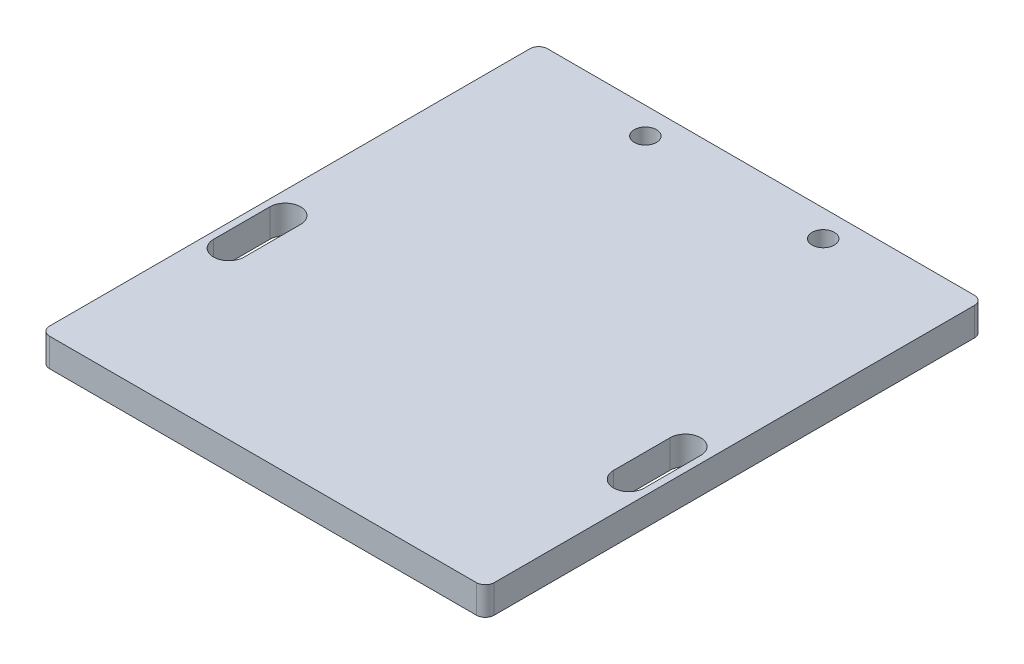
ISO-10303-21;
HEADER;
FILE_DESCRIPTION(('STEP AP214'),'2;1');
FILE_NAME('part.step','',(''),(''),'','','');
FILE_SCHEMA(('AUTOMOTIVE_DESIGN { 1 0 10303 214 1 1 1 1 }'));
ENDSEC;
DATA;
#1=APPLICATION_CONTEXT('core data for automotive mechanical design processes');
#2=APPLICATION_PROTOCOL_DEFINITION('international standard','automotive_design',2000,#1);
#3=PRODUCT_CONTEXT('',#1,'mechanical');
#4=PRODUCT('Part','Part','',(#3));
#5=PRODUCT_RELATED_PRODUCT_CATEGORY('part','',(#4));
#6=PRODUCT_DEFINITION_FORMATION('','',#4);
#7=PRODUCT_DEFINITION_CONTEXT('part definition',#1,'design');
#8=PRODUCT_DEFINITION('design','',#6,#7);
#9=PRODUCT_DEFINITION_SHAPE('','',#8);
#10=(LENGTH_UNIT() NAMED_UNIT(*) SI_UNIT(.MILLI.,.METRE.));
#11=(NAMED_UNIT(*) PLANE_ANGLE_UNIT() SI_UNIT($,.RADIAN.));
#12=(NAMED_UNIT(*) SI_UNIT($,.STERADIAN.) SOLID_ANGLE_UNIT());
#13=UNCERTAINTY_MEASURE_WITH_UNIT(LENGTH_MEASURE(1.E-05),#10,'distance_accuracy_value','');
#14=(GEOMETRIC_REPRESENTATION_CONTEXT(3) GLOBAL_UNCERTAINTY_ASSIGNED_CONTEXT((#13)) GLOBAL_UNIT_ASSIGNED_CONTEXT((#10,
#11,#12)) REPRESENTATION_CONTEXT('',''));
#15=CARTESIAN_POINT('',(0.,0.,0.));
#16=DIRECTION('',(0.,0.,1.));
#17=DIRECTION('',(1.,0.,0.));
#18=AXIS2_PLACEMENT_3D('',#15,#16,#17);
#19=CARTESIAN_POINT('',(0.,3.175,0.));
#20=DIRECTION('',(0.,1.,0.));
#21=DIRECTION('',(0.,0.,1.));
#22=AXIS2_PLACEMENT_3D('',#19,#20,#21);
#23=PLANE('',#22);
#24=DIRECTION('',(0.,0.,1.));
#25=VECTOR('',#24,1.);
#26=CARTESIAN_POINT('',(0.774999999999996,3.175,0.));
#27=LINE('',#26,#25);
#28=CARTESIAN_POINT('',(0.775,3.175,31.));
#29=VERTEX_POINT('',#28);
#30=CARTESIAN_POINT('',(0.775000000000001,3.175,37.35));
#31=VERTEX_POINT('',#30);
#32=EDGE_CURVE('E63',#29,#31,#27,.T.);
#33=ORIENTED_EDGE('',*,*,#32,.F.);
#34=CARTESIAN_POINT('',(2.5,3.175,31.));
#35=DIRECTION('',(0.,1.,0.));
#36=DIRECTION('',(0.,0.,1.));
#37=AXIS2_PLACEMENT_3D('',#34,#35,#36);
#38=CIRCLE('',#37,1.725);
#39=CARTESIAN_POINT('',(4.225,3.175,31.));
#40=VERTEX_POINT('',#39);
#41=EDGE_CURVE('E185',#40,#29,#38,.T.);
#42=ORIENTED_EDGE('',*,*,#41,.F.);
#43=DIRECTION('',(0.,0.,1.));
#44=VECTOR('',#43,1.);
#45=CARTESIAN_POINT('',(4.225,3.175,0.));
#46=LINE('',#45,#44);
#47=CARTESIAN_POINT('',(4.225,3.175,37.35));
#48=VERTEX_POINT('',#47);
#49=EDGE_CURVE('E189',#40,#48,#46,.T.);
#50=ORIENTED_EDGE('',*,*,#49,.T.);
#51=CARTESIAN_POINT('',(2.5,3.175,37.35));
#52=DIRECTION('',(0.,1.,0.));
#53=DIRECTION('',(0.,0.,1.));
#54=AXIS2_PLACEMENT_3D('',#51,#52,#53);
#55=CIRCLE('',#54,1.725);
#56=EDGE_CURVE('E198',#31,#48,#55,.T.);
#57=ORIENTED_EDGE('',*,*,#56,.F.);
#58=EDGE_LOOP('',(#33,#42,#50,#57));
#59=FACE_BOUND('',#58,.T.);
#60=DIRECTION('',(0.,0.,1.));
#61=VECTOR('',#60,1.);
#62=CARTESIAN_POINT('',(45.775,3.175,0.));
#63=LINE('',#62,#61);
#64=CARTESIAN_POINT('',(45.775,3.175,31.));
#65=VERTEX_POINT('',#64);
#66=CARTESIAN_POINT('',(45.775,3.175,37.35));
#67=VERTEX_POINT('',#66);
#68=EDGE_CURVE('E71',#65,#67,#63,.T.);
#69=ORIENTED_EDGE('',*,*,#68,.F.);
#70=CARTESIAN_POINT('',(47.5,3.175,31.));
#71=DIRECTION('',(0.,1.,0.));
#72=DIRECTION('',(0.,0.,1.));
#73=AXIS2_PLACEMENT_3D('',#70,#71,#72);
#74=CIRCLE('',#73,1.725);
#75=CARTESIAN_POINT('',(49.225,3.175,31.));
#76=VERTEX_POINT('',#75);
#77=EDGE_CURVE('E219',#76,#65,#74,.T.);
#78=ORIENTED_EDGE('',*,*,#77,.F.);
#79=DIRECTION('',(0.,0.,1.));
#80=VECTOR('',#79,1.);
#81=CARTESIAN_POINT('',(49.225,3.175,0.));
#82=LINE('',#81,#80);
#83=CARTESIAN_POINT('',(49.225,3.175,37.35));
#84=VERTEX_POINT('',#83);
#85=EDGE_CURVE('E238',#76,#84,#82,.T.);
#86=ORIENTED_EDGE('',*,*,#85,.T.);
#87=CARTESIAN_POINT('',(47.5,3.175,37.35));
#88=DIRECTION('',(0.,1.,0.));
#89=DIRECTION('',(0.,0.,1.));
#90=AXIS2_PLACEMENT_3D('',#87,#88,#89);
#91=CIRCLE('',#90,1.725);
#92=EDGE_CURVE('E234',#67,#84,#91,.T.);
#93=ORIENTED_EDGE('',*,*,#92,.F.);
#94=EDGE_LOOP('',(#69,#78,#86,#93));
#95=FACE_BOUND('',#94,.T.);
#96=CARTESIAN_POINT('',(15.,3.175,3.));
#97=DIRECTION('',(0.,1.,0.));
#98=DIRECTION('',(0.,0.,1.));
#99=AXIS2_PLACEMENT_3D('',#96,#97,#98);
#100=CIRCLE('',#99,1.25);
#101=CARTESIAN_POINT('',(15.,3.175,4.25));
#102=VERTEX_POINT('',#101);
#103=EDGE_CURVE('E208',#102,#102,#100,.T.);
#104=ORIENTED_EDGE('',*,*,#103,.F.);
#105=EDGE_LOOP('',(#104));
#106=FACE_BOUND('',#105,.T.);
#107=CARTESIAN_POINT('',(35.,3.175,3.));
#108=DIRECTION('',(0.,1.,0.));
#109=DIRECTION('',(0.,0.,1.));
#110=AXIS2_PLACEMENT_3D('',#107,#108,#109);
#111=CIRCLE('',#110,1.25);
#112=CARTESIAN_POINT('',(35.,3.175,4.25));
#113=VERTEX_POINT('',#112);
#114=EDGE_CURVE('E262',#113,#113,#111,.T.);
#115=ORIENTED_EDGE('',*,*,#114,.F.);
#116=EDGE_LOOP('',(#115));
#117=FACE_BOUND('',#116,.T.);
#118=DIRECTION('',(0.,0.,1.));
#119=VECTOR('',#118,1.);
#120=CARTESIAN_POINT('',(0.,3.175,0.));
#121=LINE('',#120,#119);
#122=CARTESIAN_POINT('',(0.,3.175,1.));
#123=VERTEX_POINT('',#122);
#124=CARTESIAN_POINT('',(0.,3.175,55.));
#125=VERTEX_POINT('',#124);
#126=EDGE_CURVE('E271',#123,#125,#121,.T.);
#127=ORIENTED_EDGE('',*,*,#126,.T.);
#128=CARTESIAN_POINT('',(1.00000000000001,3.175,55.));
#129=DIRECTION('',(0.,1.,0.));
#130=DIRECTION('',(0.,0.,1.));
#131=AXIS2_PLACEMENT_3D('',#128,#129,#130);
#132=CIRCLE('',#131,1.);
#133=CARTESIAN_POINT('',(1.00000000000001,3.175,56.));
#134=VERTEX_POINT('',#133);
#135=EDGE_CURVE('E337',#125,#134,#132,.T.);
#136=ORIENTED_EDGE('',*,*,#135,.T.);
#137=DIRECTION('',(1.,0.,0.));
#138=VECTOR('',#137,1.);
#139=CARTESIAN_POINT('',(0.,3.175,56.));
#140=LINE('',#139,#138);
#141=CARTESIAN_POINT('',(49.,3.175,56.));
#142=VERTEX_POINT('',#141);
#143=EDGE_CURVE('E275',#134,#142,#140,.T.);
#144=ORIENTED_EDGE('',*,*,#143,.T.);
#145=CARTESIAN_POINT('',(49.,3.175,55.));
#146=DIRECTION('',(0.,1.,0.));
#147=DIRECTION('',(0.,0.,1.));
#148=AXIS2_PLACEMENT_3D('',#145,#146,#147);
#149=CIRCLE('',#148,1.);
#150=CARTESIAN_POINT('',(50.,3.175,55.));
#151=VERTEX_POINT('',#150);
#152=EDGE_CURVE('E334',#142,#151,#149,.T.);
#153=ORIENTED_EDGE('',*,*,#152,.T.);
#154=DIRECTION('',(0.,0.,-1.));
#155=VECTOR('',#154,1.);
#156=CARTESIAN_POINT('',(50.,3.175,0.));
#157=LINE('',#156,#155);
#158=CARTESIAN_POINT('',(50.,3.175,1.));
#159=VERTEX_POINT('',#158);
#160=EDGE_CURVE('E280',#151,#159,#157,.T.);
#161=ORIENTED_EDGE('',*,*,#160,.T.);
#162=CARTESIAN_POINT('',(49.,3.175,1.));
#163=DIRECTION('',(0.,1.,0.));
#164=DIRECTION('',(0.,0.,1.));
#165=AXIS2_PLACEMENT_3D('',#162,#163,#164);
#166=CIRCLE('',#165,1.);
#167=CARTESIAN_POINT('',(49.,3.175,0.));
#168=VERTEX_POINT('',#167);
#169=EDGE_CURVE('E331',#159,#168,#166,.T.);
#170=ORIENTED_EDGE('',*,*,#169,.T.);
#171=DIRECTION('',(-1.,0.,0.));
#172=VECTOR('',#171,1.);
#173=CARTESIAN_POINT('',(0.,3.175,0.));
#174=LINE('',#173,#172);
#175=CARTESIAN_POINT('',(1.,3.175,0.));
#176=VERTEX_POINT('',#175);
#177=EDGE_CURVE('E284',#168,#176,#174,.T.);
#178=ORIENTED_EDGE('',*,*,#177,.T.);
#179=CARTESIAN_POINT('',(1.,3.175,1.));
#180=DIRECTION('',(0.,1.,0.));
#181=DIRECTION('',(0.,0.,1.));
#182=AXIS2_PLACEMENT_3D('',#179,#180,#181);
#183=CIRCLE('',#182,1.);
#184=EDGE_CURVE('E328',#176,#123,#183,.T.);
#185=ORIENTED_EDGE('',*,*,#184,.T.);
#186=EDGE_LOOP('',(#127,#136,#144,#153,#161,#170,#178,#185));
#187=FACE_BOUND('',#186,.T.);
#188=ADVANCED_FACE('F47',(#59,#95,#106,#117,#187),#23,.T.);
#189=CARTESIAN_POINT('',(0.,0.,0.));
#190=DIRECTION('',(0.,1.,0.));
#191=DIRECTION('',(0.,0.,1.));
#192=AXIS2_PLACEMENT_3D('',#189,#190,#191);
#193=PLANE('',#192);
#194=CARTESIAN_POINT('',(2.5,0.,31.));
#195=DIRECTION('',(0.,1.,0.));
#196=DIRECTION('',(0.,0.,1.));
#197=AXIS2_PLACEMENT_3D('',#194,#195,#196);
#198=CIRCLE('',#197,1.725);
#199=CARTESIAN_POINT('',(4.225,0.,31.));
#200=VERTEX_POINT('',#199);
#201=CARTESIAN_POINT('',(0.775,0.,31.));
#202=VERTEX_POINT('',#201);
#203=EDGE_CURVE('E170',#200,#202,#198,.T.);
#204=ORIENTED_EDGE('',*,*,#203,.T.);
#205=DIRECTION('',(0.,0.,1.));
#206=VECTOR('',#205,1.);
#207=CARTESIAN_POINT('',(0.774999999999996,0.,0.));
#208=LINE('',#207,#206);
#209=CARTESIAN_POINT('',(0.775000000000001,0.,37.35));
#210=VERTEX_POINT('',#209);
#211=EDGE_CURVE('E163',#202,#210,#208,.T.);
#212=ORIENTED_EDGE('',*,*,#211,.T.);
#213=CARTESIAN_POINT('',(2.5,0.,37.35));
#214=DIRECTION('',(0.,1.,0.));
#215=DIRECTION('',(0.,0.,1.));
#216=AXIS2_PLACEMENT_3D('',#213,#214,#215);
#217=CIRCLE('',#216,1.725);
#218=CARTESIAN_POINT('',(4.225,0.,37.35));
#219=VERTEX_POINT('',#218);
#220=EDGE_CURVE('E173',#210,#219,#217,.T.);
#221=ORIENTED_EDGE('',*,*,#220,.T.);
#222=DIRECTION('',(0.,0.,1.));
#223=VECTOR('',#222,1.);
#224=CARTESIAN_POINT('',(4.225,0.,0.));
#225=LINE('',#224,#223);
#226=EDGE_CURVE('E179',#200,#219,#225,.T.);
#227=ORIENTED_EDGE('',*,*,#226,.F.);
#228=EDGE_LOOP('',(#204,#212,#221,#227));
#229=FACE_BOUND('',#228,.T.);
#230=CARTESIAN_POINT('',(47.5,0.,31.));
#231=DIRECTION('',(0.,1.,0.));
#232=DIRECTION('',(0.,0.,1.));
#233=AXIS2_PLACEMENT_3D('',#230,#231,#232);
#234=CIRCLE('',#233,1.725);
#235=CARTESIAN_POINT('',(49.225,0.,31.));
#236=VERTEX_POINT('',#235);
#237=CARTESIAN_POINT('',(45.775,0.,31.));
#238=VERTEX_POINT('',#237);
#239=EDGE_CURVE('E227',#236,#238,#234,.T.);
#240=ORIENTED_EDGE('',*,*,#239,.T.);
#241=DIRECTION('',(0.,0.,1.));
#242=VECTOR('',#241,1.);
#243=CARTESIAN_POINT('',(45.775,0.,0.));
#244=LINE('',#243,#242);
#245=CARTESIAN_POINT('',(45.775,0.,37.35));
#246=VERTEX_POINT('',#245);
#247=EDGE_CURVE('E214',#238,#246,#244,.T.);
#248=ORIENTED_EDGE('',*,*,#247,.T.);
#249=CARTESIAN_POINT('',(47.5,0.,37.35));
#250=DIRECTION('',(0.,1.,0.));
#251=DIRECTION('',(0.,0.,1.));
#252=AXIS2_PLACEMENT_3D('',#249,#250,#251);
#253=CIRCLE('',#252,1.725);
#254=CARTESIAN_POINT('',(49.225,0.,37.35));
#255=VERTEX_POINT('',#254);
#256=EDGE_CURVE('E218',#246,#255,#253,.T.);
#257=ORIENTED_EDGE('',*,*,#256,.T.);
#258=DIRECTION('',(0.,0.,1.));
#259=VECTOR('',#258,1.);
#260=CARTESIAN_POINT('',(49.225,0.,0.));
#261=LINE('',#260,#259);
#262=EDGE_CURVE('E223',#236,#255,#261,.T.);
#263=ORIENTED_EDGE('',*,*,#262,.F.);
#264=EDGE_LOOP('',(#240,#248,#257,#263));
#265=FACE_BOUND('',#264,.T.);
#266=CARTESIAN_POINT('',(15.,0.,3.));
#267=DIRECTION('',(0.,1.,0.));
#268=DIRECTION('',(0.,0.,1.));
#269=AXIS2_PLACEMENT_3D('',#266,#267,#268);
#270=CIRCLE('',#269,1.25);
#271=CARTESIAN_POINT('',(15.,0.,4.25));
#272=VERTEX_POINT('',#271);
#273=EDGE_CURVE('E258',#272,#272,#270,.T.);
#274=ORIENTED_EDGE('',*,*,#273,.T.);
#275=EDGE_LOOP('',(#274));
#276=FACE_BOUND('',#275,.T.);
#277=CARTESIAN_POINT('',(35.,0.,3.));
#278=DIRECTION('',(0.,1.,0.));
#279=DIRECTION('',(0.,0.,1.));
#280=AXIS2_PLACEMENT_3D('',#277,#278,#279);
#281=CIRCLE('',#280,1.25);
#282=CARTESIAN_POINT('',(35.,0.,4.25));
#283=VERTEX_POINT('',#282);
#284=EDGE_CURVE('E266',#283,#283,#281,.T.);
#285=ORIENTED_EDGE('',*,*,#284,.T.);
#286=EDGE_LOOP('',(#285));
#287=FACE_BOUND('',#286,.T.);
#288=DIRECTION('',(1.,0.,0.));
#289=VECTOR('',#288,1.);
#290=CARTESIAN_POINT('',(0.,0.,56.));
#291=LINE('',#290,#289);
#292=CARTESIAN_POINT('',(1.00000000000001,0.,56.));
#293=VERTEX_POINT('',#292);
#294=CARTESIAN_POINT('',(49.,0.,56.));
#295=VERTEX_POINT('',#294);
#296=EDGE_CURVE('E292',#293,#295,#291,.T.);
#297=ORIENTED_EDGE('',*,*,#296,.F.);
#298=CARTESIAN_POINT('',(1.00000000000001,0.,55.));
#299=DIRECTION('',(0.,1.,0.));
#300=DIRECTION('',(0.,0.,1.));
#301=AXIS2_PLACEMENT_3D('',#298,#299,#300);
#302=CIRCLE('',#301,1.);
#303=CARTESIAN_POINT('',(0.,0.,55.));
#304=VERTEX_POINT('',#303);
#305=EDGE_CURVE('E318',#293,#304,#302,.F.);
#306=ORIENTED_EDGE('',*,*,#305,.T.);
#307=DIRECTION('',(0.,0.,1.));
#308=VECTOR('',#307,1.);
#309=CARTESIAN_POINT('',(0.,0.,0.));
#310=LINE('',#309,#308);
#311=CARTESIAN_POINT('',(0.,0.,1.));
#312=VERTEX_POINT('',#311);
#313=EDGE_CURVE('E270',#312,#304,#310,.T.);
#314=ORIENTED_EDGE('',*,*,#313,.F.);
#315=CARTESIAN_POINT('',(1.,0.,1.));
#316=DIRECTION('',(0.,1.,0.));
#317=DIRECTION('',(0.,0.,1.));
#318=AXIS2_PLACEMENT_3D('',#315,#316,#317);
#319=CIRCLE('',#318,1.);
#320=CARTESIAN_POINT('',(1.,0.,0.));
#321=VERTEX_POINT('',#320);
#322=EDGE_CURVE('E309',#312,#321,#319,.F.);
#323=ORIENTED_EDGE('',*,*,#322,.T.);
#324=DIRECTION('',(-1.,0.,0.));
#325=VECTOR('',#324,1.);
#326=CARTESIAN_POINT('',(0.,0.,0.));
#327=LINE('',#326,#325);
#328=CARTESIAN_POINT('',(49.,0.,0.));
#329=VERTEX_POINT('',#328);
#330=EDGE_CURVE('E276',#329,#321,#327,.T.);
#331=ORIENTED_EDGE('',*,*,#330,.F.);
#332=CARTESIAN_POINT('',(49.,0.,1.));
#333=DIRECTION('',(0.,1.,0.));
#334=DIRECTION('',(0.,0.,1.));
#335=AXIS2_PLACEMENT_3D('',#332,#333,#334);
#336=CIRCLE('',#335,1.);
#337=CARTESIAN_POINT('',(50.,0.,1.));
#338=VERTEX_POINT('',#337);
#339=EDGE_CURVE('E312',#329,#338,#336,.F.);
#340=ORIENTED_EDGE('',*,*,#339,.T.);
#341=DIRECTION('',(0.,0.,-1.));
#342=VECTOR('',#341,1.);
#343=CARTESIAN_POINT('',(50.,0.,0.));
#344=LINE('',#343,#342);
#345=CARTESIAN_POINT('',(50.,0.,55.));
#346=VERTEX_POINT('',#345);
#347=EDGE_CURVE('E296',#346,#338,#344,.T.);
#348=ORIENTED_EDGE('',*,*,#347,.F.);
#349=CARTESIAN_POINT('',(49.,0.,55.));
#350=DIRECTION('',(0.,1.,0.));
#351=DIRECTION('',(0.,0.,1.));
#352=AXIS2_PLACEMENT_3D('',#349,#350,#351);
#353=CIRCLE('',#352,1.);
#354=EDGE_CURVE('E315',#346,#295,#353,.F.);
#355=ORIENTED_EDGE('',*,*,#354,.T.);
#356=EDGE_LOOP('',(#297,#306,#314,#323,#331,#340,#348,#355));
#357=FACE_BOUND('',#356,.T.);
#358=ADVANCED_FACE('F181',(#229,#265,#276,#287,#357),#193,.F.);
#359=CARTESIAN_POINT('',(0.,3.175,0.));
#360=DIRECTION('',(1.,0.,0.));
#361=DIRECTION('',(0.,0.,-1.));
#362=AXIS2_PLACEMENT_3D('',#359,#360,#361);
#363=PLANE('',#362);
#364=ORIENTED_EDGE('',*,*,#313,.T.);
#365=DIRECTION('',(0.,-1.,0.));
#366=VECTOR('',#365,1.);
#367=CARTESIAN_POINT('',(0.,3.175,55.));
#368=LINE('',#367,#366);
#369=EDGE_CURVE('E325',#304,#125,#368,.F.);
#370=ORIENTED_EDGE('',*,*,#369,.T.);
#371=ORIENTED_EDGE('',*,*,#126,.F.);
#372=DIRECTION('',(0.,-1.,0.));
#373=VECTOR('',#372,1.);
#374=CARTESIAN_POINT('',(0.,3.175,1.));
#375=LINE('',#374,#373);
#376=EDGE_CURVE('E321',#123,#312,#375,.T.);
#377=ORIENTED_EDGE('',*,*,#376,.T.);
#378=EDGE_LOOP('',(#364,#370,#371,#377));
#379=FACE_BOUND('',#378,.T.);
#380=ADVANCED_FACE('F361',(#379),#363,.F.);
#381=CARTESIAN_POINT('',(0.,3.175,56.));
#382=DIRECTION('',(0.,0.,-1.));
#383=DIRECTION('',(-1.,0.,0.));
#384=AXIS2_PLACEMENT_3D('',#381,#382,#383);
#385=PLANE('',#384);
#386=ORIENTED_EDGE('',*,*,#143,.F.);
#387=DIRECTION('',(0.,-1.,0.));
#388=VECTOR('',#387,1.);
#389=CARTESIAN_POINT('',(1.00000000000001,3.175,56.));
#390=LINE('',#389,#388);
#391=EDGE_CURVE('E305',#134,#293,#390,.T.);
#392=ORIENTED_EDGE('',*,*,#391,.T.);
#393=ORIENTED_EDGE('',*,*,#296,.T.);
#394=DIRECTION('',(0.,-1.,0.));
#395=VECTOR('',#394,1.);
#396=CARTESIAN_POINT('',(49.,3.175,56.));
#397=LINE('',#396,#395);
#398=EDGE_CURVE('E288',#295,#142,#397,.F.);
#399=ORIENTED_EDGE('',*,*,#398,.T.);
#400=EDGE_LOOP('',(#386,#392,#393,#399));
#401=FACE_BOUND('',#400,.T.);
#402=ADVANCED_FACE('F371',(#401),#385,.F.);
#403=CARTESIAN_POINT('',(50.,3.175,0.));
#404=DIRECTION('',(-1.,0.,0.));
#405=DIRECTION('',(0.,0.,1.));
#406=AXIS2_PLACEMENT_3D('',#403,#404,#405);
#407=PLANE('',#406);
#408=ORIENTED_EDGE('',*,*,#160,.F.);
#409=DIRECTION('',(0.,-1.,0.));
#410=VECTOR('',#409,1.);
#411=CARTESIAN_POINT('',(50.,3.175,55.));
#412=LINE('',#411,#410);
#413=EDGE_CURVE('E343',#151,#346,#412,.T.);
#414=ORIENTED_EDGE('',*,*,#413,.T.);
#415=ORIENTED_EDGE('',*,*,#347,.T.);
#416=DIRECTION('',(0.,-1.,0.));
#417=VECTOR('',#416,1.);
#418=CARTESIAN_POINT('',(50.,3.175,1.));
#419=LINE('',#418,#417);
#420=EDGE_CURVE('E340',#338,#159,#419,.F.);
#421=ORIENTED_EDGE('',*,*,#420,.T.);
#422=EDGE_LOOP('',(#408,#414,#415,#421));
#423=FACE_BOUND('',#422,.T.);
#424=ADVANCED_FACE('F380',(#423),#407,.F.);
#425=CARTESIAN_POINT('',(0.,3.175,0.));
#426=DIRECTION('',(0.,0.,1.));
#427=DIRECTION('',(1.,0.,0.));
#428=AXIS2_PLACEMENT_3D('',#425,#426,#427);
#429=PLANE('',#428);
#430=ORIENTED_EDGE('',*,*,#177,.F.);
#431=DIRECTION('',(0.,-1.,0.));
#432=VECTOR('',#431,1.);
#433=CARTESIAN_POINT('',(49.,3.175,0.));
#434=LINE('',#433,#432);
#435=EDGE_CURVE('E11',#168,#329,#434,.T.);
#436=ORIENTED_EDGE('',*,*,#435,.T.);
#437=ORIENTED_EDGE('',*,*,#330,.T.);
#438=DIRECTION('',(0.,-1.,0.));
#439=VECTOR('',#438,1.);
#440=CARTESIAN_POINT('',(1.,3.175,0.));
#441=LINE('',#440,#439);
#442=EDGE_CURVE('E56',#321,#176,#441,.F.);
#443=ORIENTED_EDGE('',*,*,#442,.T.);
#444=EDGE_LOOP('',(#430,#436,#437,#443));
#445=FACE_BOUND('',#444,.T.);
#446=ADVANCED_FACE('F350',(#445),#429,.F.);
#447=CARTESIAN_POINT('',(1.00000000000001,3.175,55.));
#448=DIRECTION('',(0.,-1.,0.));
#449=DIRECTION('',(0.,0.,-1.));
#450=AXIS2_PLACEMENT_3D('',#447,#448,#449);
#451=CYLINDRICAL_SURFACE('',#450,1.);
#452=ORIENTED_EDGE('',*,*,#135,.F.);
#453=ORIENTED_EDGE('',*,*,#369,.F.);
#454=ORIENTED_EDGE('',*,*,#305,.F.);
#455=ORIENTED_EDGE('',*,*,#391,.F.);
#456=EDGE_LOOP('',(#452,#453,#454,#455));
#457=FACE_BOUND('',#456,.T.);
#458=ADVANCED_FACE('F368',(#457),#451,.T.);
#459=CARTESIAN_POINT('',(49.,3.175,55.));
#460=DIRECTION('',(0.,-1.,0.));
#461=DIRECTION('',(0.,0.,-1.));
#462=AXIS2_PLACEMENT_3D('',#459,#460,#461);
#463=CYLINDRICAL_SURFACE('',#462,1.);
#464=ORIENTED_EDGE('',*,*,#152,.F.);
#465=ORIENTED_EDGE('',*,*,#398,.F.);
#466=ORIENTED_EDGE('',*,*,#354,.F.);
#467=ORIENTED_EDGE('',*,*,#413,.F.);
#468=EDGE_LOOP('',(#464,#465,#466,#467));
#469=FACE_BOUND('',#468,.T.);
#470=ADVANCED_FACE('F377',(#469),#463,.T.);
#471=CARTESIAN_POINT('',(49.,3.175,1.));
#472=DIRECTION('',(0.,-1.,0.));
#473=DIRECTION('',(0.,0.,-1.));
#474=AXIS2_PLACEMENT_3D('',#471,#472,#473);
#475=CYLINDRICAL_SURFACE('',#474,1.);
#476=ORIENTED_EDGE('',*,*,#169,.F.);
#477=ORIENTED_EDGE('',*,*,#420,.F.);
#478=ORIENTED_EDGE('',*,*,#339,.F.);
#479=ORIENTED_EDGE('',*,*,#435,.F.);
#480=EDGE_LOOP('',(#476,#477,#478,#479));
#481=FACE_BOUND('',#480,.T.);
#482=ADVANCED_FACE('F383',(#481),#475,.T.);
#483=CARTESIAN_POINT('',(1.,3.175,1.));
#484=DIRECTION('',(0.,-1.,0.));
#485=DIRECTION('',(0.,0.,-1.));
#486=AXIS2_PLACEMENT_3D('',#483,#484,#485);
#487=CYLINDRICAL_SURFACE('',#486,1.);
#488=ORIENTED_EDGE('',*,*,#184,.F.);
#489=ORIENTED_EDGE('',*,*,#442,.F.);
#490=ORIENTED_EDGE('',*,*,#322,.F.);
#491=ORIENTED_EDGE('',*,*,#376,.F.);
#492=EDGE_LOOP('',(#488,#489,#490,#491));
#493=FACE_BOUND('',#492,.T.);
#494=ADVANCED_FACE('F49',(#493),#487,.T.);
#495=CARTESIAN_POINT('',(35.,3.175,3.));
#496=DIRECTION('',(0.,1.,0.));
#497=DIRECTION('',(0.,0.,1.));
#498=AXIS2_PLACEMENT_3D('',#495,#496,#497);
#499=CYLINDRICAL_SURFACE('',#498,1.25);
#500=ORIENTED_EDGE('',*,*,#284,.F.);
#501=EDGE_LOOP('',(#500));
#502=FACE_BOUND('',#501,.T.);
#503=ORIENTED_EDGE('',*,*,#114,.T.);
#504=EDGE_LOOP('',(#503));
#505=FACE_BOUND('',#504,.T.);
#506=ADVANCED_FACE('F389',(#502,#505),#499,.F.);
#507=CARTESIAN_POINT('',(15.,3.175,3.));
#508=DIRECTION('',(0.,1.,0.));
#509=DIRECTION('',(0.,0.,1.));
#510=AXIS2_PLACEMENT_3D('',#507,#508,#509);
#511=CYLINDRICAL_SURFACE('',#510,1.25);
#512=ORIENTED_EDGE('',*,*,#273,.F.);
#513=EDGE_LOOP('',(#512));
#514=FACE_BOUND('',#513,.T.);
#515=ORIENTED_EDGE('',*,*,#103,.T.);
#516=EDGE_LOOP('',(#515));
#517=FACE_BOUND('',#516,.T.);
#518=ADVANCED_FACE('F442',(#514,#517),#511,.F.);
#519=CARTESIAN_POINT('',(45.775,0.,0.));
#520=DIRECTION('',(-1.,0.,0.));
#521=DIRECTION('',(0.,0.,1.));
#522=AXIS2_PLACEMENT_3D('',#519,#520,#521);
#523=PLANE('',#522);
#524=ORIENTED_EDGE('',*,*,#68,.T.);
#525=DIRECTION('',(0.,1.,0.));
#526=VECTOR('',#525,1.);
#527=CARTESIAN_POINT('',(45.775,0.,37.35));
#528=LINE('',#527,#526);
#529=EDGE_CURVE('E231',#246,#67,#528,.T.);
#530=ORIENTED_EDGE('',*,*,#529,.F.);
#531=ORIENTED_EDGE('',*,*,#247,.F.);
#532=DIRECTION('',(0.,1.,0.));
#533=VECTOR('',#532,1.);
#534=CARTESIAN_POINT('',(45.775,0.,31.));
#535=LINE('',#534,#533);
#536=EDGE_CURVE('E199',#238,#65,#535,.T.);
#537=ORIENTED_EDGE('',*,*,#536,.T.);
#538=EDGE_LOOP('',(#524,#530,#531,#537));
#539=FACE_BOUND('',#538,.T.);
#540=ADVANCED_FACE('F453',(#539),#523,.F.);
#541=CARTESIAN_POINT('',(47.5,0.,31.));
#542=DIRECTION('',(0.,1.,0.));
#543=DIRECTION('',(0.,0.,1.));
#544=AXIS2_PLACEMENT_3D('',#541,#542,#543);
#545=CYLINDRICAL_SURFACE('',#544,1.725);
#546=ORIENTED_EDGE('',*,*,#77,.T.);
#547=ORIENTED_EDGE('',*,*,#536,.F.);
#548=ORIENTED_EDGE('',*,*,#239,.F.);
#549=DIRECTION('',(0.,1.,0.));
#550=VECTOR('',#549,1.);
#551=CARTESIAN_POINT('',(49.225,0.,31.));
#552=LINE('',#551,#550);
#553=EDGE_CURVE('E247',#236,#76,#552,.T.);
#554=ORIENTED_EDGE('',*,*,#553,.T.);
#555=EDGE_LOOP('',(#546,#547,#548,#554));
#556=FACE_BOUND('',#555,.T.);
#557=ADVANCED_FACE('F479',(#556),#545,.F.);
#558=CARTESIAN_POINT('',(49.225,0.,0.));
#559=DIRECTION('',(-1.,0.,0.));
#560=DIRECTION('',(0.,0.,1.));
#561=AXIS2_PLACEMENT_3D('',#558,#559,#560);
#562=PLANE('',#561);
#563=ORIENTED_EDGE('',*,*,#85,.F.);
#564=ORIENTED_EDGE('',*,*,#553,.F.);
#565=ORIENTED_EDGE('',*,*,#262,.T.);
#566=DIRECTION('',(0.,1.,0.));
#567=VECTOR('',#566,1.);
#568=CARTESIAN_POINT('',(49.225,0.,37.35));
#569=LINE('',#568,#567);
#570=EDGE_CURVE('E250',#255,#84,#569,.T.);
#571=ORIENTED_EDGE('',*,*,#570,.T.);
#572=EDGE_LOOP('',(#563,#564,#565,#571));
#573=FACE_BOUND('',#572,.T.);
#574=ADVANCED_FACE('F490',(#573),#562,.T.);
#575=CARTESIAN_POINT('',(47.5,0.,37.35));
#576=DIRECTION('',(0.,1.,0.));
#577=DIRECTION('',(0.,0.,1.));
#578=AXIS2_PLACEMENT_3D('',#575,#576,#577);
#579=CYLINDRICAL_SURFACE('',#578,1.725);
#580=ORIENTED_EDGE('',*,*,#92,.T.);
#581=ORIENTED_EDGE('',*,*,#570,.F.);
#582=ORIENTED_EDGE('',*,*,#256,.F.);
#583=ORIENTED_EDGE('',*,*,#529,.T.);
#584=EDGE_LOOP('',(#580,#581,#582,#583));
#585=FACE_BOUND('',#584,.T.);
#586=ADVANCED_FACE('F500',(#585),#579,.F.);
#587=CARTESIAN_POINT('',(0.774999999999996,0.,0.));
#588=DIRECTION('',(-1.,0.,0.));
#589=DIRECTION('',(0.,0.,1.));
#590=AXIS2_PLACEMENT_3D('',#587,#588,#589);
#591=PLANE('',#590);
#592=ORIENTED_EDGE('',*,*,#32,.T.);
#593=DIRECTION('',(0.,1.,0.));
#594=VECTOR('',#593,1.);
#595=CARTESIAN_POINT('',(0.775000000000001,0.,37.35));
#596=LINE('',#595,#594);
#597=EDGE_CURVE('E159',#210,#31,#596,.T.);
#598=ORIENTED_EDGE('',*,*,#597,.F.);
#599=ORIENTED_EDGE('',*,*,#211,.F.);
#600=DIRECTION('',(0.,1.,0.));
#601=VECTOR('',#600,1.);
#602=CARTESIAN_POINT('',(0.775,0.,31.));
#603=LINE('',#602,#601);
#604=EDGE_CURVE('E205',#202,#29,#603,.T.);
#605=ORIENTED_EDGE('',*,*,#604,.T.);
#606=EDGE_LOOP('',(#592,#598,#599,#605));
#607=FACE_BOUND('',#606,.T.);
#608=ADVANCED_FACE('F161',(#607),#591,.F.);
#609=CARTESIAN_POINT('',(2.5,0.,31.));
#610=DIRECTION('',(0.,1.,0.));
#611=DIRECTION('',(0.,0.,1.));
#612=AXIS2_PLACEMENT_3D('',#609,#610,#611);
#613=CYLINDRICAL_SURFACE('',#612,1.725);
#614=ORIENTED_EDGE('',*,*,#41,.T.);
#615=ORIENTED_EDGE('',*,*,#604,.F.);
#616=ORIENTED_EDGE('',*,*,#203,.F.);
#617=DIRECTION('',(0.,1.,0.));
#618=VECTOR('',#617,1.);
#619=CARTESIAN_POINT('',(4.225,0.,31.));
#620=LINE('',#619,#618);
#621=EDGE_CURVE('E209',#200,#40,#620,.T.);
#622=ORIENTED_EDGE('',*,*,#621,.T.);
#623=EDGE_LOOP('',(#614,#615,#616,#622));
#624=FACE_BOUND('',#623,.T.);
#625=ADVANCED_FACE('F521',(#624),#613,.F.);
#626=CARTESIAN_POINT('',(4.225,0.,0.));
#627=DIRECTION('',(-1.,0.,0.));
#628=DIRECTION('',(0.,0.,1.));
#629=AXIS2_PLACEMENT_3D('',#626,#627,#628);
#630=PLANE('',#629);
#631=ORIENTED_EDGE('',*,*,#49,.F.);
#632=ORIENTED_EDGE('',*,*,#621,.F.);
#633=ORIENTED_EDGE('',*,*,#226,.T.);
#634=DIRECTION('',(0.,1.,0.));
#635=VECTOR('',#634,1.);
#636=CARTESIAN_POINT('',(4.225,0.,37.35));
#637=LINE('',#636,#635);
#638=EDGE_CURVE('E169',#219,#48,#637,.T.);
#639=ORIENTED_EDGE('',*,*,#638,.T.);
#640=EDGE_LOOP('',(#631,#632,#633,#639));
#641=FACE_BOUND('',#640,.T.);
#642=ADVANCED_FACE('F532',(#641),#630,.T.);
#643=CARTESIAN_POINT('',(2.5,0.,37.35));
#644=DIRECTION('',(0.,1.,0.));
#645=DIRECTION('',(0.,0.,1.));
#646=AXIS2_PLACEMENT_3D('',#643,#644,#645);
#647=CYLINDRICAL_SURFACE('',#646,1.725);
#648=ORIENTED_EDGE('',*,*,#56,.T.);
#649=ORIENTED_EDGE('',*,*,#638,.F.);
#650=ORIENTED_EDGE('',*,*,#220,.F.);
#651=ORIENTED_EDGE('',*,*,#597,.T.);
#652=EDGE_LOOP('',(#648,#649,#650,#651));
#653=FACE_BOUND('',#652,.T.);
#654=ADVANCED_FACE('F174',(#653),#647,.F.);
#655=CLOSED_SHELL('',(#188,#358,#380,#402,#424,#446,#458,#470,#482,#494,#506,#518,#540,#557,
#574,#586,#608,#625,#642,#654));
#656=MANIFOLD_SOLID_BREP('B2',#655);
#657=ADVANCED_BREP_SHAPE_REPRESENTATION('',(#18,#656),#14);
#658=SHAPE_DEFINITION_REPRESENTATION(#9,#657);
ENDSEC;
END-ISO-10303-21;
